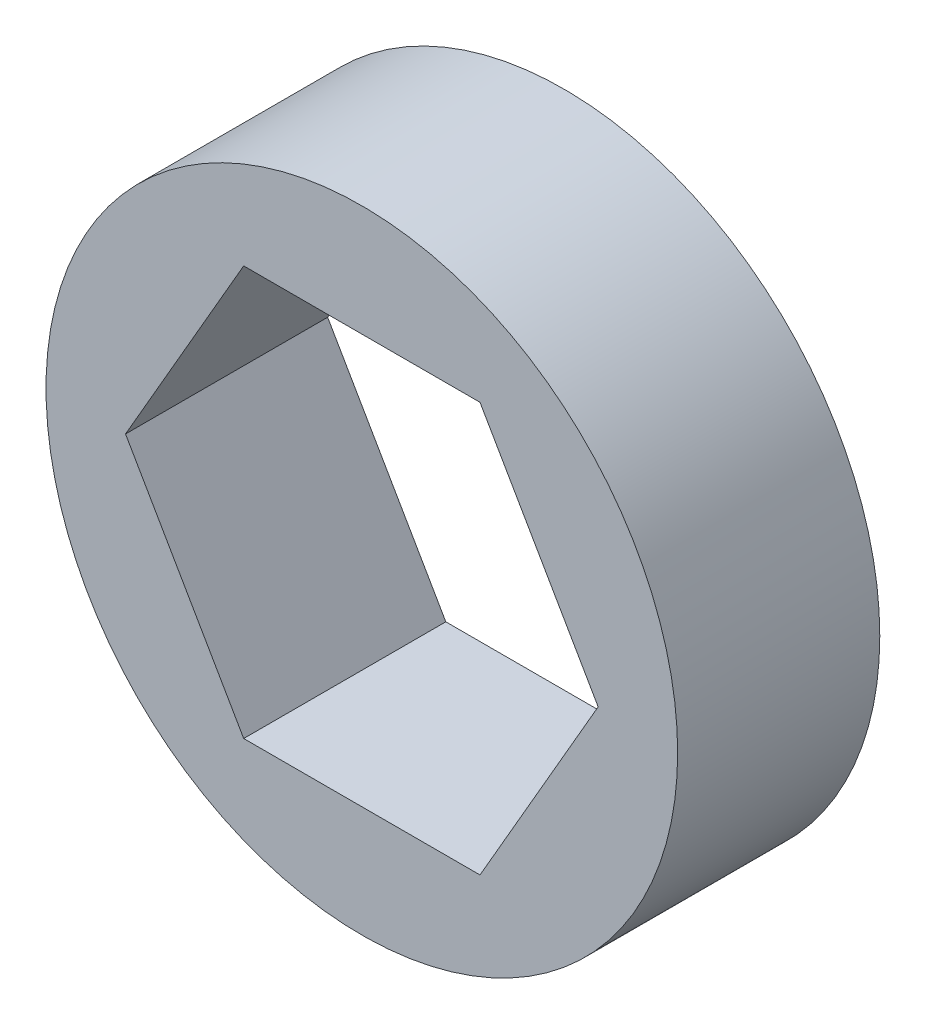
ISO-10303-21;
HEADER;
FILE_DESCRIPTION(('STEP AP214'),'2;1');
FILE_NAME('part.step','',(''),(''),'','','');
FILE_SCHEMA(('AUTOMOTIVE_DESIGN { 1 0 10303 214 1 1 1 1 }'));
ENDSEC;
DATA;
#1=APPLICATION_CONTEXT('core data for automotive mechanical design processes');
#2=APPLICATION_PROTOCOL_DEFINITION('international standard','automotive_design',2000,#1);
#3=PRODUCT_CONTEXT('',#1,'mechanical');
#4=PRODUCT('Part','Part','',(#3));
#5=PRODUCT_RELATED_PRODUCT_CATEGORY('part','',(#4));
#6=PRODUCT_DEFINITION_FORMATION('','',#4);
#7=PRODUCT_DEFINITION_CONTEXT('part definition',#1,'design');
#8=PRODUCT_DEFINITION('design','',#6,#7);
#9=PRODUCT_DEFINITION_SHAPE('','',#8);
#10=(LENGTH_UNIT() NAMED_UNIT(*) SI_UNIT(.MILLI.,.METRE.));
#11=(NAMED_UNIT(*) PLANE_ANGLE_UNIT() SI_UNIT($,.RADIAN.));
#12=(NAMED_UNIT(*) SI_UNIT($,.STERADIAN.) SOLID_ANGLE_UNIT());
#13=UNCERTAINTY_MEASURE_WITH_UNIT(LENGTH_MEASURE(1.E-05),#10,'distance_accuracy_value','');
#14=(GEOMETRIC_REPRESENTATION_CONTEXT(3) GLOBAL_UNCERTAINTY_ASSIGNED_CONTEXT((#13)) GLOBAL_UNIT_ASSIGNED_CONTEXT((#10,
#11,#12)) REPRESENTATION_CONTEXT('',''));
#15=CARTESIAN_POINT('',(0.,0.,0.));
#16=DIRECTION('',(0.,0.,1.));
#17=DIRECTION('',(1.,0.,0.));
#18=AXIS2_PLACEMENT_3D('',#15,#16,#17);
#19=CARTESIAN_POINT('',(0.,0.,5.08));
#20=DIRECTION('',(0.,0.,1.));
#21=DIRECTION('',(1.,0.,0.));
#22=AXIS2_PLACEMENT_3D('',#19,#20,#21);
#23=PLANE('',#22);
#24=CARTESIAN_POINT('',(0.,0.,5.08));
#25=DIRECTION('',(0.,0.,1.));
#26=DIRECTION('',(1.,0.,0.));
#27=AXIS2_PLACEMENT_3D('',#24,#25,#26);
#28=CIRCLE('',#27,7.9375);
#29=CARTESIAN_POINT('',(7.9375,0.,5.08));
#30=VERTEX_POINT('',#29);
#31=EDGE_CURVE('E11',#30,#30,#28,.T.);
#32=ORIENTED_EDGE('',*,*,#31,.T.);
#33=EDGE_LOOP('',(#32));
#34=FACE_BOUND('',#33,.T.);
#35=DIRECTION('',(0.5,0.866025403784439,0.));
#36=VECTOR('',#35,1.);
#37=CARTESIAN_POINT('',(2.96960110957684,-5.1435,5.08));
#38=LINE('',#37,#36);
#39=CARTESIAN_POINT('',(2.96960110957684,-5.1435,5.08));
#40=VERTEX_POINT('',#39);
#41=CARTESIAN_POINT('',(5.93920221915368,0.,5.08));
#42=VERTEX_POINT('',#41);
#43=EDGE_CURVE('E93',#40,#42,#38,.T.);
#44=ORIENTED_EDGE('',*,*,#43,.F.);
#45=DIRECTION('',(1.,0.,0.));
#46=VECTOR('',#45,1.);
#47=CARTESIAN_POINT('',(-2.96960110957684,-5.1435,5.08));
#48=LINE('',#47,#46);
#49=CARTESIAN_POINT('',(-2.96960110957684,-5.1435,5.08));
#50=VERTEX_POINT('',#49);
#51=EDGE_CURVE('E85',#50,#40,#48,.T.);
#52=ORIENTED_EDGE('',*,*,#51,.F.);
#53=DIRECTION('',(0.5,-0.866025403784439,0.));
#54=VECTOR('',#53,1.);
#55=CARTESIAN_POINT('',(-5.93920221915368,0.,5.08));
#56=LINE('',#55,#54);
#57=CARTESIAN_POINT('',(-5.93920221915368,0.,5.08));
#58=VERTEX_POINT('',#57);
#59=EDGE_CURVE('E113',#58,#50,#56,.T.);
#60=ORIENTED_EDGE('',*,*,#59,.F.);
#61=DIRECTION('',(-0.5,-0.866025403784439,0.));
#62=VECTOR('',#61,1.);
#63=CARTESIAN_POINT('',(-2.96960110957684,5.1435,5.08));
#64=LINE('',#63,#62);
#65=CARTESIAN_POINT('',(-2.96960110957684,5.1435,5.08));
#66=VERTEX_POINT('',#65);
#67=EDGE_CURVE('E111',#66,#58,#64,.T.);
#68=ORIENTED_EDGE('',*,*,#67,.F.);
#69=DIRECTION('',(-1.,0.,0.));
#70=VECTOR('',#69,1.);
#71=CARTESIAN_POINT('',(2.96960110957684,5.1435,5.08));
#72=LINE('',#71,#70);
#73=CARTESIAN_POINT('',(2.96960110957684,5.1435,5.08));
#74=VERTEX_POINT('',#73);
#75=EDGE_CURVE('E107',#74,#66,#72,.T.);
#76=ORIENTED_EDGE('',*,*,#75,.F.);
#77=DIRECTION('',(-0.5,0.866025403784439,0.));
#78=VECTOR('',#77,1.);
#79=CARTESIAN_POINT('',(5.93920221915368,0.,5.08));
#80=LINE('',#79,#78);
#81=EDGE_CURVE('E105',#42,#74,#80,.T.);
#82=ORIENTED_EDGE('',*,*,#81,.F.);
#83=EDGE_LOOP('',(#44,#52,#60,#68,#76,#82));
#84=FACE_BOUND('',#83,.T.);
#85=ADVANCED_FACE('F32',(#34,#84),#23,.T.);
#86=CARTESIAN_POINT('',(0.,0.,0.));
#87=DIRECTION('',(0.,0.,1.));
#88=DIRECTION('',(1.,0.,0.));
#89=AXIS2_PLACEMENT_3D('',#86,#87,#88);
#90=PLANE('',#89);
#91=CARTESIAN_POINT('',(0.,0.,0.));
#92=DIRECTION('',(0.,0.,1.));
#93=DIRECTION('',(1.,0.,0.));
#94=AXIS2_PLACEMENT_3D('',#91,#92,#93);
#95=CIRCLE('',#94,7.9375);
#96=CARTESIAN_POINT('',(7.9375,0.,0.));
#97=VERTEX_POINT('',#96);
#98=EDGE_CURVE('E36',#97,#97,#95,.T.);
#99=ORIENTED_EDGE('',*,*,#98,.F.);
#100=EDGE_LOOP('',(#99));
#101=FACE_BOUND('',#100,.T.);
#102=DIRECTION('',(1.,0.,0.));
#103=VECTOR('',#102,1.);
#104=CARTESIAN_POINT('',(-2.96960110957684,-5.1435,0.));
#105=LINE('',#104,#103);
#106=CARTESIAN_POINT('',(-2.96960110957684,-5.1435,0.));
#107=VERTEX_POINT('',#106);
#108=CARTESIAN_POINT('',(2.96960110957684,-5.1435,0.));
#109=VERTEX_POINT('',#108);
#110=EDGE_CURVE('E55',#107,#109,#105,.T.);
#111=ORIENTED_EDGE('',*,*,#110,.T.);
#112=DIRECTION('',(0.5,0.866025403784439,0.));
#113=VECTOR('',#112,1.);
#114=CARTESIAN_POINT('',(2.96960110957684,-5.1435,0.));
#115=LINE('',#114,#113);
#116=CARTESIAN_POINT('',(5.93920221915368,0.,0.));
#117=VERTEX_POINT('',#116);
#118=EDGE_CURVE('E100',#109,#117,#115,.T.);
#119=ORIENTED_EDGE('',*,*,#118,.T.);
#120=DIRECTION('',(-0.5,0.866025403784439,0.));
#121=VECTOR('',#120,1.);
#122=CARTESIAN_POINT('',(5.93920221915368,0.,0.));
#123=LINE('',#122,#121);
#124=CARTESIAN_POINT('',(2.96960110957684,5.1435,0.));
#125=VERTEX_POINT('',#124);
#126=EDGE_CURVE('E117',#117,#125,#123,.T.);
#127=ORIENTED_EDGE('',*,*,#126,.T.);
#128=DIRECTION('',(-1.,0.,0.));
#129=VECTOR('',#128,1.);
#130=CARTESIAN_POINT('',(2.96960110957684,5.1435,0.));
#131=LINE('',#130,#129);
#132=CARTESIAN_POINT('',(-2.96960110957684,5.1435,0.));
#133=VERTEX_POINT('',#132);
#134=EDGE_CURVE('E120',#125,#133,#131,.T.);
#135=ORIENTED_EDGE('',*,*,#134,.T.);
#136=DIRECTION('',(-0.5,-0.866025403784439,0.));
#137=VECTOR('',#136,1.);
#138=CARTESIAN_POINT('',(-2.96960110957684,5.1435,0.));
#139=LINE('',#138,#137);
#140=CARTESIAN_POINT('',(-5.93920221915368,0.,0.));
#141=VERTEX_POINT('',#140);
#142=EDGE_CURVE('E123',#133,#141,#139,.T.);
#143=ORIENTED_EDGE('',*,*,#142,.T.);
#144=DIRECTION('',(0.5,-0.866025403784439,0.));
#145=VECTOR('',#144,1.);
#146=CARTESIAN_POINT('',(-5.93920221915368,0.,0.));
#147=LINE('',#146,#145);
#148=EDGE_CURVE('E94',#141,#107,#147,.T.);
#149=ORIENTED_EDGE('',*,*,#148,.T.);
#150=EDGE_LOOP('',(#111,#119,#127,#135,#143,#149));
#151=FACE_BOUND('',#150,.T.);
#152=ADVANCED_FACE('F140',(#101,#151),#90,.F.);
#153=CARTESIAN_POINT('',(0.,0.,5.08));
#154=DIRECTION('',(0.,0.,-1.));
#155=DIRECTION('',(-1.,0.,0.));
#156=AXIS2_PLACEMENT_3D('',#153,#154,#155);
#157=CYLINDRICAL_SURFACE('',#156,7.9375);
#158=ORIENTED_EDGE('',*,*,#31,.F.);
#159=EDGE_LOOP('',(#158));
#160=FACE_BOUND('',#159,.T.);
#161=ORIENTED_EDGE('',*,*,#98,.T.);
#162=EDGE_LOOP('',(#161));
#163=FACE_BOUND('',#162,.T.);
#164=ADVANCED_FACE('F34',(#160,#163),#157,.T.);
#165=CARTESIAN_POINT('',(-2.96960110957684,-5.1435,5.08));
#166=DIRECTION('',(0.,1.,0.));
#167=DIRECTION('',(-1.,0.,0.));
#168=AXIS2_PLACEMENT_3D('',#165,#166,#167);
#169=PLANE('',#168);
#170=ORIENTED_EDGE('',*,*,#110,.F.);
#171=DIRECTION('',(0.,0.,-1.));
#172=VECTOR('',#171,1.);
#173=CARTESIAN_POINT('',(-2.96960110957684,-5.1435,5.08));
#174=LINE('',#173,#172);
#175=EDGE_CURVE('E89',#50,#107,#174,.T.);
#176=ORIENTED_EDGE('',*,*,#175,.F.);
#177=ORIENTED_EDGE('',*,*,#51,.T.);
#178=DIRECTION('',(0.,0.,-1.));
#179=VECTOR('',#178,1.);
#180=CARTESIAN_POINT('',(2.96960110957684,-5.1435,5.08));
#181=LINE('',#180,#179);
#182=EDGE_CURVE('E88',#40,#109,#181,.T.);
#183=ORIENTED_EDGE('',*,*,#182,.T.);
#184=EDGE_LOOP('',(#170,#176,#177,#183));
#185=FACE_BOUND('',#184,.T.);
#186=ADVANCED_FACE('F87',(#185),#169,.T.);
#187=CARTESIAN_POINT('',(2.96960110957684,-5.1435,5.08));
#188=DIRECTION('',(-0.866025403784439,0.5,0.));
#189=DIRECTION('',(-0.5,-0.866025403784439,0.));
#190=AXIS2_PLACEMENT_3D('',#187,#188,#189);
#191=PLANE('',#190);
#192=ORIENTED_EDGE('',*,*,#118,.F.);
#193=ORIENTED_EDGE('',*,*,#182,.F.);
#194=ORIENTED_EDGE('',*,*,#43,.T.);
#195=DIRECTION('',(0.,0.,-1.));
#196=VECTOR('',#195,1.);
#197=CARTESIAN_POINT('',(5.93920221915368,0.,5.08));
#198=LINE('',#197,#196);
#199=EDGE_CURVE('E101',#42,#117,#198,.T.);
#200=ORIENTED_EDGE('',*,*,#199,.T.);
#201=EDGE_LOOP('',(#192,#193,#194,#200));
#202=FACE_BOUND('',#201,.T.);
#203=ADVANCED_FACE('F97',(#202),#191,.T.);
#204=CARTESIAN_POINT('',(5.93920221915368,0.,5.08));
#205=DIRECTION('',(-0.866025403784439,-0.5,0.));
#206=DIRECTION('',(0.5,-0.866025403784439,0.));
#207=AXIS2_PLACEMENT_3D('',#204,#205,#206);
#208=PLANE('',#207);
#209=ORIENTED_EDGE('',*,*,#126,.F.);
#210=ORIENTED_EDGE('',*,*,#199,.F.);
#211=ORIENTED_EDGE('',*,*,#81,.T.);
#212=DIRECTION('',(0.,0.,-1.));
#213=VECTOR('',#212,1.);
#214=CARTESIAN_POINT('',(2.96960110957684,5.1435,5.08));
#215=LINE('',#214,#213);
#216=EDGE_CURVE('E132',#74,#125,#215,.T.);
#217=ORIENTED_EDGE('',*,*,#216,.T.);
#218=EDGE_LOOP('',(#209,#210,#211,#217));
#219=FACE_BOUND('',#218,.T.);
#220=ADVANCED_FACE('F136',(#219),#208,.T.);
#221=CARTESIAN_POINT('',(2.96960110957684,5.1435,5.08));
#222=DIRECTION('',(0.,-1.,0.));
#223=DIRECTION('',(0.,0.,-1.));
#224=AXIS2_PLACEMENT_3D('',#221,#222,#223);
#225=PLANE('',#224);
#226=ORIENTED_EDGE('',*,*,#134,.F.);
#227=ORIENTED_EDGE('',*,*,#216,.F.);
#228=ORIENTED_EDGE('',*,*,#75,.T.);
#229=DIRECTION('',(0.,0.,-1.));
#230=VECTOR('',#229,1.);
#231=CARTESIAN_POINT('',(-2.96960110957684,5.1435,5.08));
#232=LINE('',#231,#230);
#233=EDGE_CURVE('E130',#66,#133,#232,.T.);
#234=ORIENTED_EDGE('',*,*,#233,.T.);
#235=EDGE_LOOP('',(#226,#227,#228,#234));
#236=FACE_BOUND('',#235,.T.);
#237=ADVANCED_FACE('F148',(#236),#225,.T.);
#238=CARTESIAN_POINT('',(-2.96960110957684,5.1435,5.08));
#239=DIRECTION('',(0.866025403784439,-0.5,0.));
#240=DIRECTION('',(0.5,0.866025403784439,0.));
#241=AXIS2_PLACEMENT_3D('',#238,#239,#240);
#242=PLANE('',#241);
#243=ORIENTED_EDGE('',*,*,#142,.F.);
#244=ORIENTED_EDGE('',*,*,#233,.F.);
#245=ORIENTED_EDGE('',*,*,#67,.T.);
#246=DIRECTION('',(0.,0.,-1.));
#247=VECTOR('',#246,1.);
#248=CARTESIAN_POINT('',(-5.93920221915368,0.,5.08));
#249=LINE('',#248,#247);
#250=EDGE_CURVE('E47',#58,#141,#249,.T.);
#251=ORIENTED_EDGE('',*,*,#250,.T.);
#252=EDGE_LOOP('',(#243,#244,#245,#251));
#253=FACE_BOUND('',#252,.T.);
#254=ADVANCED_FACE('F146',(#253),#242,.T.);
#255=CARTESIAN_POINT('',(-5.93920221915368,0.,5.08));
#256=DIRECTION('',(0.866025403784439,0.5,0.));
#257=DIRECTION('',(-0.5,0.866025403784439,0.));
#258=AXIS2_PLACEMENT_3D('',#255,#256,#257);
#259=PLANE('',#258);
#260=ORIENTED_EDGE('',*,*,#148,.F.);
#261=ORIENTED_EDGE('',*,*,#250,.F.);
#262=ORIENTED_EDGE('',*,*,#59,.T.);
#263=ORIENTED_EDGE('',*,*,#175,.T.);
#264=EDGE_LOOP('',(#260,#261,#262,#263));
#265=FACE_BOUND('',#264,.T.);
#266=ADVANCED_FACE('F142',(#265),#259,.T.);
#267=CLOSED_SHELL('',(#85,#152,#164,#186,#203,#220,#237,#254,#266));
#268=MANIFOLD_SOLID_BREP('B2',#267);
#269=ADVANCED_BREP_SHAPE_REPRESENTATION('',(#18,#268),#14);
#270=SHAPE_DEFINITION_REPRESENTATION(#9,#269);
ENDSEC;
END-ISO-10303-21;
